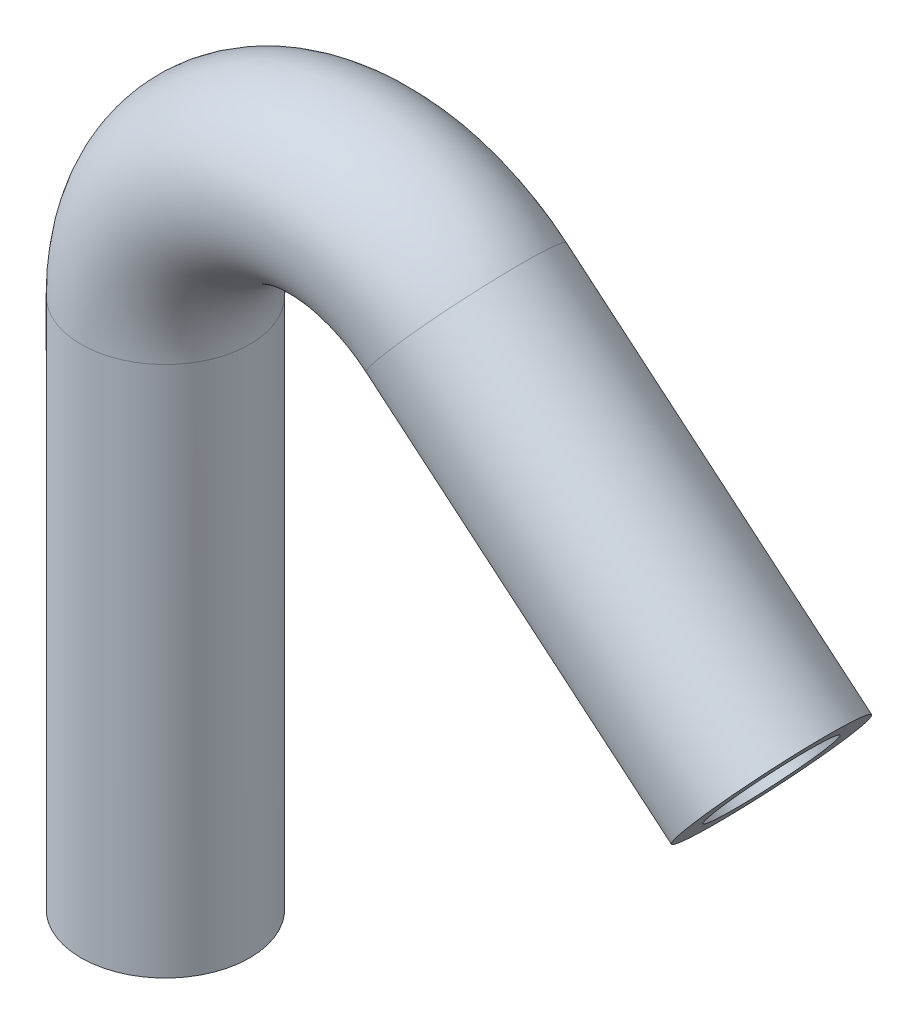
ISO-10303-21;
HEADER;
FILE_DESCRIPTION(('STEP AP214'),'2;1');
FILE_NAME('part.step','',(''),(''),'','','');
FILE_SCHEMA(('AUTOMOTIVE_DESIGN { 1 0 10303 214 1 1 1 1 }'));
ENDSEC;
DATA;
#1=APPLICATION_CONTEXT('core data for automotive mechanical design processes');
#2=APPLICATION_PROTOCOL_DEFINITION('international standard','automotive_design',2000,#1);
#3=PRODUCT_CONTEXT('',#1,'mechanical');
#4=PRODUCT('Part','Part','',(#3));
#5=PRODUCT_RELATED_PRODUCT_CATEGORY('part','',(#4));
#6=PRODUCT_DEFINITION_FORMATION('','',#4);
#7=PRODUCT_DEFINITION_CONTEXT('part definition',#1,'design');
#8=PRODUCT_DEFINITION('design','',#6,#7);
#9=PRODUCT_DEFINITION_SHAPE('','',#8);
#10=(LENGTH_UNIT() NAMED_UNIT(*) SI_UNIT(.MILLI.,.METRE.));
#11=(NAMED_UNIT(*) PLANE_ANGLE_UNIT() SI_UNIT($,.RADIAN.));
#12=(NAMED_UNIT(*) SI_UNIT($,.STERADIAN.) SOLID_ANGLE_UNIT());
#13=UNCERTAINTY_MEASURE_WITH_UNIT(LENGTH_MEASURE(1.E-05),#10,'distance_accuracy_value','');
#14=(GEOMETRIC_REPRESENTATION_CONTEXT(3) GLOBAL_UNCERTAINTY_ASSIGNED_CONTEXT((#13)) GLOBAL_UNIT_ASSIGNED_CONTEXT((#10,
#11,#12)) REPRESENTATION_CONTEXT('',''));
#15=CARTESIAN_POINT('',(0.,0.,0.));
#16=DIRECTION('',(0.,0.,1.));
#17=DIRECTION('',(1.,0.,0.));
#18=AXIS2_PLACEMENT_3D('',#15,#16,#17);
#19=CARTESIAN_POINT('',(0.,0.,0.));
#20=DIRECTION('',(0.,-1.,0.));
#21=DIRECTION('',(1.,0.,0.));
#22=AXIS2_PLACEMENT_3D('',#19,#20,#21);
#23=PLANE('',#22);
#24=CARTESIAN_POINT('',(0.,0.,0.));
#25=DIRECTION('',(0.,-1.,0.));
#26=DIRECTION('',(1.,0.,0.));
#27=AXIS2_PLACEMENT_3D('',#24,#25,#26);
#28=CIRCLE('',#27,2.175);
#29=CARTESIAN_POINT('',(2.175,0.,0.));
#30=VERTEX_POINT('',#29);
#31=EDGE_CURVE('E65',#30,#30,#28,.T.);
#32=ORIENTED_EDGE('',*,*,#31,.F.);
#33=EDGE_LOOP('',(#32));
#34=FACE_BOUND('',#33,.T.);
#35=CARTESIAN_POINT('',(0.,0.,0.));
#36=DIRECTION('',(0.,-1.,0.));
#37=DIRECTION('',(1.,0.,0.));
#38=AXIS2_PLACEMENT_3D('',#35,#36,#37);
#39=CIRCLE('',#38,3.175);
#40=CARTESIAN_POINT('',(3.175,0.,0.));
#41=VERTEX_POINT('',#40);
#42=EDGE_CURVE('E56',#41,#41,#39,.T.);
#43=ORIENTED_EDGE('',*,*,#42,.T.);
#44=EDGE_LOOP('',(#43));
#45=FACE_BOUND('',#44,.T.);
#46=ADVANCED_FACE('F42',(#34,#45),#23,.T.);
#47=CARTESIAN_POINT('',(22.8148992304972,15.6387622312153,0.));
#48=DIRECTION('',(-0.766044443118974,0.642787609686544,0.));
#49=DIRECTION('',(-0.642787609686544,-0.766044443118974,0.));
#50=AXIS2_PLACEMENT_3D('',#47,#48,#49);
#51=PLANE('',#50);
#52=CARTESIAN_POINT('',(22.8148992304972,15.6387622312153,0.));
#53=DIRECTION('',(-0.766044443118974,0.642787609686544,0.));
#54=DIRECTION('',(-0.642787609686544,-0.766044443118974,0.));
#55=AXIS2_PLACEMENT_3D('',#52,#53,#54);
#56=CIRCLE('',#55,2.175);
#57=CARTESIAN_POINT('',(21.4168361794289,13.9726155674316,0.));
#58=VERTEX_POINT('',#57);
#59=EDGE_CURVE('E61',#58,#58,#56,.T.);
#60=ORIENTED_EDGE('',*,*,#59,.T.);
#61=EDGE_LOOP('',(#60));
#62=FACE_BOUND('',#61,.T.);
#63=CARTESIAN_POINT('',(22.8148992304972,15.6387622312153,0.));
#64=DIRECTION('',(-0.766044443118974,0.642787609686544,0.));
#65=DIRECTION('',(-0.642787609686544,-0.766044443118974,0.));
#66=AXIS2_PLACEMENT_3D('',#63,#64,#65);
#67=CIRCLE('',#66,3.175);
#68=CARTESIAN_POINT('',(20.7740485697424,13.2065711243126,0.));
#69=VERTEX_POINT('',#68);
#70=EDGE_CURVE('E11',#69,#69,#67,.T.);
#71=ORIENTED_EDGE('',*,*,#70,.F.);
#72=EDGE_LOOP('',(#71));
#73=FACE_BOUND('',#72,.T.);
#74=ADVANCED_FACE('F85',(#62,#73),#51,.F.);
#75=CARTESIAN_POINT('',(0.,0.,0.));
#76=DIRECTION('',(0.,1.,0.));
#77=DIRECTION('',(0.,0.,1.));
#78=AXIS2_PLACEMENT_3D('',#75,#76,#77);
#79=CYLINDRICAL_SURFACE('',#78,3.175);
#80=CARTESIAN_POINT('',(0.,20.,0.));
#81=DIRECTION('',(0.,-1.,0.));
#82=DIRECTION('',(1.,0.,0.));
#83=AXIS2_PLACEMENT_3D('',#80,#81,#82);
#84=CIRCLE('',#83,3.175);
#85=CARTESIAN_POINT('',(-3.175,20.,0.));
#86=VERTEX_POINT('',#85);
#87=EDGE_CURVE('E52',#86,#86,#84,.T.);
#88=ORIENTED_EDGE('',*,*,#87,.T.);
#89=EDGE_LOOP('',(#88));
#90=FACE_BOUND('',#89,.T.);
#91=ORIENTED_EDGE('',*,*,#42,.F.);
#92=EDGE_LOOP('',(#91));
#93=FACE_BOUND('',#92,.T.);
#94=ADVANCED_FACE('F89',(#90,#93),#79,.T.);
#95=CARTESIAN_POINT('',(6.89330289377656,20.,0.));
#96=DIRECTION('',(0.,0.,-1.));
#97=DIRECTION('',(-1.,0.,0.));
#98=AXIS2_PLACEMENT_3D('',#95,#96,#97);
#99=TOROIDAL_SURFACE('',#98,6.89330289377657,3.175);
#100=CARTESIAN_POINT('',(11.3242325837125,25.2805763765135,0.));
#101=DIRECTION('',(-0.766044443118974,0.642787609686544,0.));
#102=DIRECTION('',(-0.642787609686544,-0.766044443118974,0.));
#103=AXIS2_PLACEMENT_3D('',#100,#101,#102);
#104=CIRCLE('',#103,3.175);
#105=CARTESIAN_POINT('',(13.3650832444673,27.7127674834162,0.));
#106=VERTEX_POINT('',#105);
#107=EDGE_CURVE('E48',#106,#106,#104,.T.);
#108=CARTESIAN_POINT('',(6.89330289377656,20.,0.));
#109=DIRECTION('',(0.,0.,-1.));
#110=DIRECTION('',(-1.,0.,0.));
#111=AXIS2_PLACEMENT_3D('',#108,#109,#110);
#112=CIRCLE('',#111,10.0683028937766);
#113=EDGE_CURVE('',#86,#106,#112,.T.);
#114=ORIENTED_EDGE('',*,*,#87,.F.);
#115=ORIENTED_EDGE('',*,*,#107,.T.);
#116=ORIENTED_EDGE('',*,*,#113,.T.);
#117=ORIENTED_EDGE('',*,*,#113,.F.);
#118=EDGE_LOOP('',(#114,#116,#115,#117));
#119=FACE_BOUND('',#118,.T.);
#120=ADVANCED_FACE('F91',(#119),#99,.T.);
#121=CARTESIAN_POINT('',(11.3242325837125,25.2805763765135,0.));
#122=DIRECTION('',(0.766044443118974,-0.642787609686544,0.));
#123=DIRECTION('',(0.642787609686544,0.766044443118974,0.));
#124=AXIS2_PLACEMENT_3D('',#121,#122,#123);
#125=CYLINDRICAL_SURFACE('',#124,3.175);
#126=ORIENTED_EDGE('',*,*,#70,.T.);
#127=EDGE_LOOP('',(#126));
#128=FACE_BOUND('',#127,.T.);
#129=ORIENTED_EDGE('',*,*,#107,.F.);
#130=EDGE_LOOP('',(#129));
#131=FACE_BOUND('',#130,.T.);
#132=ADVANCED_FACE('F79',(#128,#131),#125,.T.);
#133=CARTESIAN_POINT('',(0.,0.,0.));
#134=DIRECTION('',(0.,1.,0.));
#135=DIRECTION('',(0.,0.,1.));
#136=AXIS2_PLACEMENT_3D('',#133,#134,#135);
#137=CYLINDRICAL_SURFACE('',#136,2.175);
#138=CARTESIAN_POINT('',(0.,20.,0.));
#139=DIRECTION('',(0.,1.,0.));
#140=DIRECTION('',(0.,0.,1.));
#141=AXIS2_PLACEMENT_3D('',#138,#139,#140);
#142=CIRCLE('',#141,2.175);
#143=CARTESIAN_POINT('',(-2.175,20.,0.));
#144=VERTEX_POINT('',#143);
#145=EDGE_CURVE('E68',#144,#144,#142,.F.);
#146=ORIENTED_EDGE('',*,*,#145,.F.);
#147=EDGE_LOOP('',(#146));
#148=FACE_BOUND('',#147,.T.);
#149=ORIENTED_EDGE('',*,*,#31,.T.);
#150=EDGE_LOOP('',(#149));
#151=FACE_BOUND('',#150,.T.);
#152=ADVANCED_FACE('F76',(#148,#151),#137,.F.);
#153=CARTESIAN_POINT('',(6.89330289377656,20.,0.));
#154=DIRECTION('',(0.,0.,-1.));
#155=DIRECTION('',(-1.,0.,0.));
#156=AXIS2_PLACEMENT_3D('',#153,#154,#155);
#157=TOROIDAL_SURFACE('',#156,6.89330289377657,2.175);
#158=CARTESIAN_POINT('',(11.3242325837125,25.2805763765135,0.));
#159=DIRECTION('',(-0.766044443118973,0.642787609686545,0.));
#160=DIRECTION('',(-0.642787609686545,-0.766044443118973,0.));
#161=AXIS2_PLACEMENT_3D('',#158,#159,#160);
#162=CIRCLE('',#161,2.175);
#163=CARTESIAN_POINT('',(12.7222956347808,26.9467230402972,0.));
#164=VERTEX_POINT('',#163);
#165=EDGE_CURVE('E64',#164,#164,#162,.T.);
#166=CARTESIAN_POINT('',(6.89330289377656,20.,0.));
#167=DIRECTION('',(0.,0.,-1.));
#168=DIRECTION('',(-1.,0.,0.));
#169=AXIS2_PLACEMENT_3D('',#166,#167,#168);
#170=CIRCLE('',#169,9.06830289377657);
#171=EDGE_CURVE('',#144,#164,#170,.T.);
#172=ORIENTED_EDGE('',*,*,#145,.T.);
#173=ORIENTED_EDGE('',*,*,#165,.F.);
#174=ORIENTED_EDGE('',*,*,#171,.T.);
#175=ORIENTED_EDGE('',*,*,#171,.F.);
#176=EDGE_LOOP('',(#172,#174,#173,#175));
#177=FACE_BOUND('',#176,.T.);
#178=ADVANCED_FACE('F74',(#177),#157,.F.);
#179=CARTESIAN_POINT('',(11.3242325837125,25.2805763765135,0.));
#180=DIRECTION('',(0.766044443118974,-0.642787609686544,0.));
#181=DIRECTION('',(0.642787609686544,0.766044443118974,0.));
#182=AXIS2_PLACEMENT_3D('',#179,#180,#181);
#183=CYLINDRICAL_SURFACE('',#182,2.175);
#184=ORIENTED_EDGE('',*,*,#59,.F.);
#185=EDGE_LOOP('',(#184));
#186=FACE_BOUND('',#185,.T.);
#187=ORIENTED_EDGE('',*,*,#165,.T.);
#188=EDGE_LOOP('',(#187));
#189=FACE_BOUND('',#188,.T.);
#190=ADVANCED_FACE('F86',(#186,#189),#183,.F.);
#191=CLOSED_SHELL('',(#46,#74,#94,#120,#132,#152,#178,#190));
#192=MANIFOLD_SOLID_BREP('B2',#191);
#193=ADVANCED_BREP_SHAPE_REPRESENTATION('',(#18,#192),#14);
#194=SHAPE_DEFINITION_REPRESENTATION(#9,#193);
ENDSEC;
END-ISO-10303-21;
